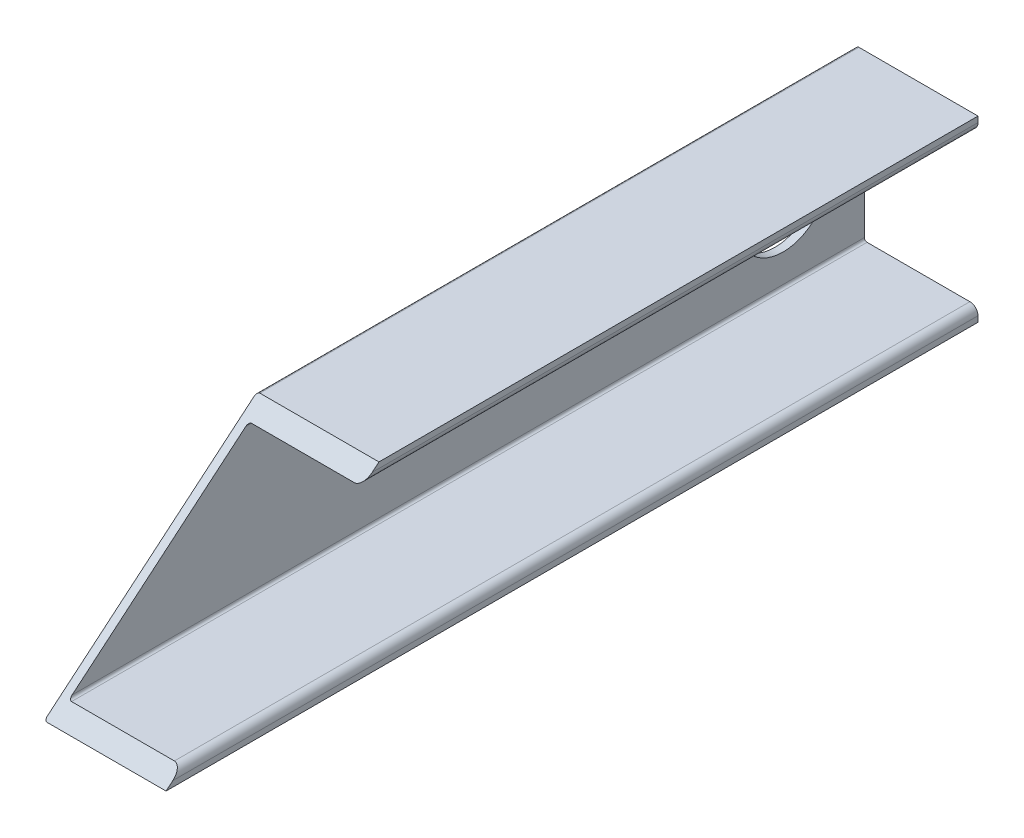
ISO-10303-21;
HEADER;
FILE_DESCRIPTION(('STEP AP214'),'2;1');
FILE_NAME('part.step','',(''),(''),'','','');
FILE_SCHEMA(('AUTOMOTIVE_DESIGN { 1 0 10303 214 1 1 1 1 }'));
ENDSEC;
DATA;
#1=APPLICATION_CONTEXT('core data for automotive mechanical design processes');
#2=APPLICATION_PROTOCOL_DEFINITION('international standard','automotive_design',2000,#1);
#3=PRODUCT_CONTEXT('',#1,'mechanical');
#4=PRODUCT('Part','Part','',(#3));
#5=PRODUCT_RELATED_PRODUCT_CATEGORY('part','',(#4));
#6=PRODUCT_DEFINITION_FORMATION('','',#4);
#7=PRODUCT_DEFINITION_CONTEXT('part definition',#1,'design');
#8=PRODUCT_DEFINITION('design','',#6,#7);
#9=PRODUCT_DEFINITION_SHAPE('','',#8);
#10=(LENGTH_UNIT() NAMED_UNIT(*) SI_UNIT(.MILLI.,.METRE.));
#11=(NAMED_UNIT(*) PLANE_ANGLE_UNIT() SI_UNIT($,.RADIAN.));
#12=(NAMED_UNIT(*) SI_UNIT($,.STERADIAN.) SOLID_ANGLE_UNIT());
#13=UNCERTAINTY_MEASURE_WITH_UNIT(LENGTH_MEASURE(1.E-05),#10,'distance_accuracy_value','');
#14=(GEOMETRIC_REPRESENTATION_CONTEXT(3) GLOBAL_UNCERTAINTY_ASSIGNED_CONTEXT((#13)) GLOBAL_UNIT_ASSIGNED_CONTEXT((#10,
#11,#12)) REPRESENTATION_CONTEXT('',''));
#15=CARTESIAN_POINT('',(0.,0.,0.));
#16=DIRECTION('',(0.,0.,1.));
#17=DIRECTION('',(1.,0.,0.));
#18=AXIS2_PLACEMENT_3D('',#15,#16,#17);
#19=CARTESIAN_POINT('',(3.00000000000002,-27.9,300.));
#20=DIRECTION('',(-1.,0.,0.));
#21=DIRECTION('',(0.,0.,1.));
#22=AXIS2_PLACEMENT_3D('',#19,#20,#21);
#23=PLANE('',#22);
#24=CARTESIAN_POINT('',(3.00000000000002,0.,30.));
#25=DIRECTION('',(-1.,0.,0.));
#26=DIRECTION('',(0.,0.,1.));
#27=AXIS2_PLACEMENT_3D('',#24,#25,#26);
#28=CIRCLE('',#27,16.5);
#29=CARTESIAN_POINT('',(3.00000000000002,0.,46.5));
#30=VERTEX_POINT('',#29);
#31=EDGE_CURVE('E156',#30,#30,#28,.T.);
#32=ORIENTED_EDGE('',*,*,#31,.T.);
#33=EDGE_LOOP('',(#32));
#34=FACE_BOUND('',#33,.T.);
#35=DIRECTION('',(0.,0.642787609686543,-0.766044443118975));
#36=VECTOR('',#35,1.);
#37=CARTESIAN_POINT('',(3.00000000000002,-33.,300.));
#38=LINE('',#37,#36);
#39=CARTESIAN_POINT('',(3.00000000000002,-26.9,292.730303085175));
#40=VERTEX_POINT('',#39);
#41=CARTESIAN_POINT('',(3.00000000000002,26.9,228.613959803608));
#42=VERTEX_POINT('',#41);
#43=EDGE_CURVE('E241',#40,#42,#38,.T.);
#44=ORIENTED_EDGE('',*,*,#43,.F.);
#45=DIRECTION('',(0.,0.,-1.));
#46=VECTOR('',#45,1.);
#47=CARTESIAN_POINT('',(3.00000000000002,-26.9,0.));
#48=LINE('',#47,#46);
#49=CARTESIAN_POINT('',(3.00000000000002,-26.9,0.));
#50=VERTEX_POINT('',#49);
#51=EDGE_CURVE('E194',#40,#50,#48,.T.);
#52=ORIENTED_EDGE('',*,*,#51,.T.);
#53=DIRECTION('',(0.,1.,0.));
#54=VECTOR('',#53,1.);
#55=CARTESIAN_POINT('',(3.00000000000002,-27.9,0.));
#56=LINE('',#55,#54);
#57=CARTESIAN_POINT('',(3.00000000000002,26.9,0.));
#58=VERTEX_POINT('',#57);
#59=EDGE_CURVE('E228',#50,#58,#56,.T.);
#60=ORIENTED_EDGE('',*,*,#59,.T.);
#61=DIRECTION('',(0.,0.,-1.));
#62=VECTOR('',#61,1.);
#63=CARTESIAN_POINT('',(3.00000000000002,26.9,227.422206211013));
#64=LINE('',#63,#62);
#65=EDGE_CURVE('E192',#58,#42,#64,.F.);
#66=ORIENTED_EDGE('',*,*,#65,.T.);
#67=EDGE_LOOP('',(#44,#52,#60,#66));
#68=FACE_BOUND('',#67,.T.);
#69=ADVANCED_FACE('F44',(#34,#68),#23,.F.);
#70=CARTESIAN_POINT('',(3.00000000000002,27.9,300.));
#71=DIRECTION('',(0.,1.,0.));
#72=DIRECTION('',(0.,0.,1.));
#73=AXIS2_PLACEMENT_3D('',#70,#71,#72);
#74=PLANE('',#73);
#75=DIRECTION('',(1.,0.,0.));
#76=VECTOR('',#75,1.);
#77=CARTESIAN_POINT('',(45.001,27.9,227.422206211013));
#78=LINE('',#77,#76);
#79=CARTESIAN_POINT('',(4.00000000000002,27.9,227.422206211013));
#80=VERTEX_POINT('',#79);
#81=CARTESIAN_POINT('',(42.,27.9,227.422206211013));
#82=VERTEX_POINT('',#81);
#83=EDGE_CURVE('E236',#80,#82,#78,.T.);
#84=ORIENTED_EDGE('',*,*,#83,.F.);
#85=DIRECTION('',(0.,0.,-1.));
#86=VECTOR('',#85,1.);
#87=CARTESIAN_POINT('',(4.00000000000002,27.9,0.));
#88=LINE('',#87,#86);
#89=CARTESIAN_POINT('',(4.00000000000002,27.9,0.));
#90=VERTEX_POINT('',#89);
#91=EDGE_CURVE('E216',#80,#90,#88,.T.);
#92=ORIENTED_EDGE('',*,*,#91,.T.);
#93=DIRECTION('',(1.,0.,0.));
#94=VECTOR('',#93,1.);
#95=CARTESIAN_POINT('',(3.00000000000002,27.9,0.));
#96=LINE('',#95,#94);
#97=CARTESIAN_POINT('',(42.,27.9,0.));
#98=VERTEX_POINT('',#97);
#99=EDGE_CURVE('E229',#90,#98,#96,.T.);
#100=ORIENTED_EDGE('',*,*,#99,.T.);
#101=DIRECTION('',(0.,0.,-1.));
#102=VECTOR('',#101,1.);
#103=CARTESIAN_POINT('',(42.,27.9,300.));
#104=LINE('',#103,#102);
#105=EDGE_CURVE('E189',#98,#82,#104,.F.);
#106=ORIENTED_EDGE('',*,*,#105,.T.);
#107=EDGE_LOOP('',(#84,#92,#100,#106));
#108=FACE_BOUND('',#107,.T.);
#109=ADVANCED_FACE('F239',(#108),#74,.F.);
#110=CARTESIAN_POINT('',(45.,27.9,300.));
#111=DIRECTION('',(-1.,0.,0.));
#112=DIRECTION('',(0.,0.,1.));
#113=AXIS2_PLACEMENT_3D('',#110,#111,#112);
#114=PLANE('',#113);
#115=DIRECTION('',(0.,0.642787609686543,-0.766044443118975));
#116=VECTOR('',#115,1.);
#117=CARTESIAN_POINT('',(45.,-33.,300.));
#118=LINE('',#117,#116);
#119=CARTESIAN_POINT('',(45.,30.9,223.846945433231));
#120=VERTEX_POINT('',#119);
#121=CARTESIAN_POINT('',(45.,33.,221.344262888783));
#122=VERTEX_POINT('',#121);
#123=EDGE_CURVE('E144',#120,#122,#118,.T.);
#124=ORIENTED_EDGE('',*,*,#123,.F.);
#125=DIRECTION('',(0.,0.,-1.));
#126=VECTOR('',#125,1.);
#127=CARTESIAN_POINT('',(45.,30.9,300.));
#128=LINE('',#127,#126);
#129=CARTESIAN_POINT('',(45.,30.9,0.));
#130=VERTEX_POINT('',#129);
#131=EDGE_CURVE('E187',#120,#130,#128,.T.);
#132=ORIENTED_EDGE('',*,*,#131,.T.);
#133=DIRECTION('',(0.,1.,0.));
#134=VECTOR('',#133,1.);
#135=CARTESIAN_POINT('',(45.,27.9,0.));
#136=LINE('',#135,#134);
#137=CARTESIAN_POINT('',(45.,33.,0.));
#138=VERTEX_POINT('',#137);
#139=EDGE_CURVE('E166',#130,#138,#136,.T.);
#140=ORIENTED_EDGE('',*,*,#139,.T.);
#141=DIRECTION('',(0.,0.,-1.));
#142=VECTOR('',#141,1.);
#143=CARTESIAN_POINT('',(45.,33.,300.));
#144=LINE('',#143,#142);
#145=EDGE_CURVE('E160',#122,#138,#144,.T.);
#146=ORIENTED_EDGE('',*,*,#145,.F.);
#147=EDGE_LOOP('',(#124,#132,#140,#146));
#148=FACE_BOUND('',#147,.T.);
#149=ADVANCED_FACE('F164',(#148),#114,.F.);
#150=CARTESIAN_POINT('',(0.,33.,300.));
#151=DIRECTION('',(0.,-1.,0.));
#152=DIRECTION('',(0.,0.,-1.));
#153=AXIS2_PLACEMENT_3D('',#150,#151,#152);
#154=PLANE('',#153);
#155=DIRECTION('',(-1.,0.,0.));
#156=VECTOR('',#155,1.);
#157=CARTESIAN_POINT('',(0.,33.,0.));
#158=LINE('',#157,#156);
#159=CARTESIAN_POINT('',(0.99999999999999,33.,0.));
#160=VERTEX_POINT('',#159);
#161=EDGE_CURVE('E251',#138,#160,#158,.T.);
#162=ORIENTED_EDGE('',*,*,#161,.T.);
#163=DIRECTION('',(0.,0.,-1.));
#164=VECTOR('',#163,1.);
#165=CARTESIAN_POINT('',(0.99999999999999,33.,300.));
#166=LINE('',#165,#164);
#167=CARTESIAN_POINT('',(0.999999999999987,33.,221.344262888783));
#168=VERTEX_POINT('',#167);
#169=EDGE_CURVE('E59',#160,#168,#166,.F.);
#170=ORIENTED_EDGE('',*,*,#169,.T.);
#171=DIRECTION('',(-1.,0.,0.));
#172=VECTOR('',#171,1.);
#173=CARTESIAN_POINT('',(45.001,33.,221.344262888783));
#174=LINE('',#173,#172);
#175=EDGE_CURVE('E147',#122,#168,#174,.T.);
#176=ORIENTED_EDGE('',*,*,#175,.F.);
#177=ORIENTED_EDGE('',*,*,#145,.T.);
#178=EDGE_LOOP('',(#162,#170,#176,#177));
#179=FACE_BOUND('',#178,.T.);
#180=ADVANCED_FACE('F159',(#179),#154,.F.);
#181=CARTESIAN_POINT('',(0.,33.,300.));
#182=DIRECTION('',(1.,0.,0.));
#183=DIRECTION('',(0.,1.,0.));
#184=AXIS2_PLACEMENT_3D('',#181,#182,#183);
#185=PLANE('',#184);
#186=CARTESIAN_POINT('',(0.,0.,30.));
#187=DIRECTION('',(-1.,0.,0.));
#188=DIRECTION('',(0.,-1.,0.));
#189=AXIS2_PLACEMENT_3D('',#186,#187,#188);
#190=CIRCLE('',#189,16.5);
#191=CARTESIAN_POINT('',(0.,-16.5,30.));
#192=VERTEX_POINT('',#191);
#193=EDGE_CURVE('E278',#192,#192,#190,.T.);
#194=ORIENTED_EDGE('',*,*,#193,.F.);
#195=EDGE_LOOP('',(#194));
#196=FACE_BOUND('',#195,.T.);
#197=DIRECTION('',(0.,-1.,0.));
#198=VECTOR('',#197,1.);
#199=CARTESIAN_POINT('',(0.,33.,0.));
#200=LINE('',#199,#198);
#201=CARTESIAN_POINT('',(0.,32.,0.));
#202=VERTEX_POINT('',#201);
#203=CARTESIAN_POINT('',(0.,-32.,0.));
#204=VERTEX_POINT('',#203);
#205=EDGE_CURVE('E253',#202,#204,#200,.T.);
#206=ORIENTED_EDGE('',*,*,#205,.T.);
#207=DIRECTION('',(0.,0.,-1.));
#208=VECTOR('',#207,1.);
#209=CARTESIAN_POINT('',(0.,-32.,300.));
#210=LINE('',#209,#208);
#211=CARTESIAN_POINT('',(0.,-32.,298.808246407406));
#212=VERTEX_POINT('',#211);
#213=EDGE_CURVE('E209',#204,#212,#210,.F.);
#214=ORIENTED_EDGE('',*,*,#213,.T.);
#215=DIRECTION('',(0.,-0.642787609686543,0.766044443118975));
#216=VECTOR('',#215,1.);
#217=CARTESIAN_POINT('',(0.,-33.,300.));
#218=LINE('',#217,#216);
#219=CARTESIAN_POINT('',(0.,32.,222.536016481377));
#220=VERTEX_POINT('',#219);
#221=EDGE_CURVE('E155',#220,#212,#218,.T.);
#222=ORIENTED_EDGE('',*,*,#221,.F.);
#223=DIRECTION('',(0.,0.,-1.));
#224=VECTOR('',#223,1.);
#225=CARTESIAN_POINT('',(0.,32.,300.));
#226=LINE('',#225,#224);
#227=EDGE_CURVE('E206',#220,#202,#226,.T.);
#228=ORIENTED_EDGE('',*,*,#227,.T.);
#229=EDGE_LOOP('',(#206,#214,#222,#228));
#230=FACE_BOUND('',#229,.T.);
#231=ADVANCED_FACE('F285',(#196,#230),#185,.F.);
#232=CARTESIAN_POINT('',(0.,-33.,300.));
#233=DIRECTION('',(0.,1.,0.));
#234=DIRECTION('',(0.,0.,1.));
#235=AXIS2_PLACEMENT_3D('',#232,#233,#234);
#236=PLANE('',#235);
#237=DIRECTION('',(1.,0.,0.));
#238=VECTOR('',#237,1.);
#239=CARTESIAN_POINT('',(0.,-33.,300.));
#240=LINE('',#239,#238);
#241=CARTESIAN_POINT('',(1.00000000000001,-33.,300.));
#242=VERTEX_POINT('',#241);
#243=CARTESIAN_POINT('',(45.,-33.,300.));
#244=VERTEX_POINT('',#243);
#245=EDGE_CURVE('E174',#242,#244,#240,.T.);
#246=ORIENTED_EDGE('',*,*,#245,.F.);
#247=DIRECTION('',(0.,0.,-1.));
#248=VECTOR('',#247,1.);
#249=CARTESIAN_POINT('',(1.00000000000001,-33.,300.));
#250=LINE('',#249,#248);
#251=CARTESIAN_POINT('',(1.00000000000001,-33.,0.));
#252=VERTEX_POINT('',#251);
#253=EDGE_CURVE('E199',#242,#252,#250,.T.);
#254=ORIENTED_EDGE('',*,*,#253,.T.);
#255=DIRECTION('',(1.,0.,0.));
#256=VECTOR('',#255,1.);
#257=CARTESIAN_POINT('',(0.,-33.,0.));
#258=LINE('',#257,#256);
#259=CARTESIAN_POINT('',(45.,-33.,0.));
#260=VERTEX_POINT('',#259);
#261=EDGE_CURVE('E256',#252,#260,#258,.T.);
#262=ORIENTED_EDGE('',*,*,#261,.T.);
#263=DIRECTION('',(0.,0.,-1.));
#264=VECTOR('',#263,1.);
#265=CARTESIAN_POINT('',(45.,-33.,300.));
#266=LINE('',#265,#264);
#267=EDGE_CURVE('E168',#244,#260,#266,.T.);
#268=ORIENTED_EDGE('',*,*,#267,.F.);
#269=EDGE_LOOP('',(#246,#254,#262,#268));
#270=FACE_BOUND('',#269,.T.);
#271=ADVANCED_FACE('F288',(#270),#236,.F.);
#272=CARTESIAN_POINT('',(45.,-33.,300.));
#273=DIRECTION('',(-1.,0.,0.));
#274=DIRECTION('',(0.,0.,1.));
#275=AXIS2_PLACEMENT_3D('',#272,#273,#274);
#276=PLANE('',#275);
#277=DIRECTION('',(0.,1.,0.));
#278=VECTOR('',#277,1.);
#279=CARTESIAN_POINT('',(45.,-33.,0.));
#280=LINE('',#279,#278);
#281=CARTESIAN_POINT('',(45.,-30.9,0.));
#282=VERTEX_POINT('',#281);
#283=EDGE_CURVE('E258',#260,#282,#280,.T.);
#284=ORIENTED_EDGE('',*,*,#283,.T.);
#285=DIRECTION('',(0.,0.,-1.));
#286=VECTOR('',#285,1.);
#287=CARTESIAN_POINT('',(45.,-30.9,300.));
#288=LINE('',#287,#286);
#289=CARTESIAN_POINT('',(45.,-30.9,297.497317455552));
#290=VERTEX_POINT('',#289);
#291=EDGE_CURVE('E182',#282,#290,#288,.F.);
#292=ORIENTED_EDGE('',*,*,#291,.T.);
#293=DIRECTION('',(0.,0.642787609686543,-0.766044443118975));
#294=VECTOR('',#293,1.);
#295=CARTESIAN_POINT('',(45.,-33.,300.));
#296=LINE('',#295,#294);
#297=EDGE_CURVE('E243',#244,#290,#296,.T.);
#298=ORIENTED_EDGE('',*,*,#297,.F.);
#299=ORIENTED_EDGE('',*,*,#267,.T.);
#300=EDGE_LOOP('',(#284,#292,#298,#299));
#301=FACE_BOUND('',#300,.T.);
#302=ADVANCED_FACE('F304',(#301),#276,.F.);
#303=CARTESIAN_POINT('',(45.,-27.9,300.));
#304=DIRECTION('',(0.,-1.,0.));
#305=DIRECTION('',(0.,0.,-1.));
#306=AXIS2_PLACEMENT_3D('',#303,#304,#305);
#307=PLANE('',#306);
#308=DIRECTION('',(-1.,0.,0.));
#309=VECTOR('',#308,1.);
#310=CARTESIAN_POINT('',(45.,-27.9,0.));
#311=LINE('',#310,#309);
#312=CARTESIAN_POINT('',(42.,-27.9,0.));
#313=VERTEX_POINT('',#312);
#314=CARTESIAN_POINT('',(4.00000000000002,-27.9,0.));
#315=VERTEX_POINT('',#314);
#316=EDGE_CURVE('E247',#313,#315,#311,.T.);
#317=ORIENTED_EDGE('',*,*,#316,.T.);
#318=DIRECTION('',(0.,0.,-1.));
#319=VECTOR('',#318,1.);
#320=CARTESIAN_POINT('',(4.00000000000002,-27.9,293.92205667777));
#321=LINE('',#320,#319);
#322=CARTESIAN_POINT('',(4.00000000000002,-27.9,293.92205667777));
#323=VERTEX_POINT('',#322);
#324=EDGE_CURVE('E197',#315,#323,#321,.F.);
#325=ORIENTED_EDGE('',*,*,#324,.T.);
#326=DIRECTION('',(-1.,0.,0.));
#327=VECTOR('',#326,1.);
#328=CARTESIAN_POINT('',(45.001,-27.9,293.92205667777));
#329=LINE('',#328,#327);
#330=CARTESIAN_POINT('',(42.,-27.9,293.92205667777));
#331=VERTEX_POINT('',#330);
#332=EDGE_CURVE('E162',#331,#323,#329,.T.);
#333=ORIENTED_EDGE('',*,*,#332,.F.);
#334=DIRECTION('',(0.,0.,-1.));
#335=VECTOR('',#334,1.);
#336=CARTESIAN_POINT('',(42.,-27.9,300.));
#337=LINE('',#336,#335);
#338=EDGE_CURVE('E167',#331,#313,#337,.T.);
#339=ORIENTED_EDGE('',*,*,#338,.T.);
#340=EDGE_LOOP('',(#317,#325,#333,#339));
#341=FACE_BOUND('',#340,.T.);
#342=ADVANCED_FACE('F264',(#341),#307,.F.);
#343=CARTESIAN_POINT('',(0.,0.,0.));
#344=DIRECTION('',(0.,0.,-1.));
#345=DIRECTION('',(-1.,0.,0.));
#346=AXIS2_PLACEMENT_3D('',#343,#344,#345);
#347=PLANE('',#346);
#348=ORIENTED_EDGE('',*,*,#261,.F.);
#349=CARTESIAN_POINT('',(1.00000000000001,-32.,0.));
#350=DIRECTION('',(0.,0.,-1.));
#351=DIRECTION('',(-1.,0.,0.));
#352=AXIS2_PLACEMENT_3D('',#349,#350,#351);
#353=CIRCLE('',#352,1.);
#354=EDGE_CURVE('E204',#252,#204,#353,.T.);
#355=ORIENTED_EDGE('',*,*,#354,.T.);
#356=ORIENTED_EDGE('',*,*,#205,.F.);
#357=CARTESIAN_POINT('',(0.99999999999999,32.,0.));
#358=DIRECTION('',(0.,0.,-1.));
#359=DIRECTION('',(-1.,0.,0.));
#360=AXIS2_PLACEMENT_3D('',#357,#358,#359);
#361=CIRCLE('',#360,1.);
#362=EDGE_CURVE('E202',#202,#160,#361,.T.);
#363=ORIENTED_EDGE('',*,*,#362,.T.);
#364=ORIENTED_EDGE('',*,*,#161,.F.);
#365=ORIENTED_EDGE('',*,*,#139,.F.);
#366=CARTESIAN_POINT('',(42.,30.9,0.));
#367=DIRECTION('',(0.,0.,-1.));
#368=DIRECTION('',(-1.,0.,0.));
#369=AXIS2_PLACEMENT_3D('',#366,#367,#368);
#370=CIRCLE('',#369,3.);
#371=EDGE_CURVE('E171',#130,#98,#370,.T.);
#372=ORIENTED_EDGE('',*,*,#371,.T.);
#373=ORIENTED_EDGE('',*,*,#99,.F.);
#374=CARTESIAN_POINT('',(4.00000000000002,26.9,0.));
#375=DIRECTION('',(0.,0.,-1.));
#376=DIRECTION('',(-1.,0.,0.));
#377=AXIS2_PLACEMENT_3D('',#374,#375,#376);
#378=CIRCLE('',#377,1.);
#379=EDGE_CURVE('E52',#90,#58,#378,.F.);
#380=ORIENTED_EDGE('',*,*,#379,.T.);
#381=ORIENTED_EDGE('',*,*,#59,.F.);
#382=CARTESIAN_POINT('',(4.00000000000002,-26.9,0.));
#383=DIRECTION('',(0.,0.,-1.));
#384=DIRECTION('',(-1.,0.,0.));
#385=AXIS2_PLACEMENT_3D('',#382,#383,#384);
#386=CIRCLE('',#385,1.);
#387=EDGE_CURVE('E219',#50,#315,#386,.F.);
#388=ORIENTED_EDGE('',*,*,#387,.T.);
#389=ORIENTED_EDGE('',*,*,#316,.F.);
#390=CARTESIAN_POINT('',(42.,-30.9,0.));
#391=DIRECTION('',(0.,0.,-1.));
#392=DIRECTION('',(-1.,0.,0.));
#393=AXIS2_PLACEMENT_3D('',#390,#391,#392);
#394=CIRCLE('',#393,3.);
#395=EDGE_CURVE('E180',#313,#282,#394,.T.);
#396=ORIENTED_EDGE('',*,*,#395,.T.);
#397=ORIENTED_EDGE('',*,*,#283,.F.);
#398=EDGE_LOOP('',(#348,#355,#356,#363,#364,#365,#372,#373,#380,#381,#388,#389,#396,#397));
#399=FACE_BOUND('',#398,.T.);
#400=ADVANCED_FACE('F227',(#399),#347,.T.);
#401=CARTESIAN_POINT('',(45.001,-33.,300.));
#402=DIRECTION('',(0.,-0.766044443118975,-0.642787609686543));
#403=DIRECTION('',(0.,0.642787609686543,-0.766044443118975));
#404=AXIS2_PLACEMENT_3D('',#401,#402,#403);
#405=PLANE('',#404);
#406=ORIENTED_EDGE('',*,*,#221,.T.);
#407=CARTESIAN_POINT('',(1.00000000000001,-32.,298.808246407406));
#408=DIRECTION('',(0.,-0.766044443118975,-0.642787609686543));
#409=DIRECTION('',(0.,0.642787609686543,-0.766044443118975));
#410=AXIS2_PLACEMENT_3D('',#407,#408,#409);
#411=ELLIPSE('',#410,1.5557238268604,1.);
#412=EDGE_CURVE('E213',#212,#242,#411,.F.);
#413=ORIENTED_EDGE('',*,*,#412,.T.);
#414=ORIENTED_EDGE('',*,*,#245,.T.);
#415=ORIENTED_EDGE('',*,*,#297,.T.);
#416=CARTESIAN_POINT('',(42.,-30.9,297.497317455552));
#417=DIRECTION('',(0.,-0.766044443118975,-0.642787609686543));
#418=DIRECTION('',(0.,0.642787609686543,-0.766044443118975));
#419=AXIS2_PLACEMENT_3D('',#416,#417,#418);
#420=ELLIPSE('',#419,4.66717148058121,3.);
#421=EDGE_CURVE('E185',#290,#331,#420,.F.);
#422=ORIENTED_EDGE('',*,*,#421,.T.);
#423=ORIENTED_EDGE('',*,*,#332,.T.);
#424=CARTESIAN_POINT('',(4.00000000000002,-26.9,292.730303085175));
#425=DIRECTION('',(0.,-0.766044443118975,-0.642787609686543));
#426=DIRECTION('',(0.,-0.642787609686543,0.766044443118975));
#427=AXIS2_PLACEMENT_3D('',#424,#425,#426);
#428=ELLIPSE('',#427,1.5557238268604,1.);
#429=EDGE_CURVE('E221',#323,#40,#428,.T.);
#430=ORIENTED_EDGE('',*,*,#429,.T.);
#431=ORIENTED_EDGE('',*,*,#43,.T.);
#432=CARTESIAN_POINT('',(4.00000000000002,26.9,228.613959803608));
#433=DIRECTION('',(0.,-0.766044443118975,-0.642787609686543));
#434=DIRECTION('',(0.,-0.642787609686543,0.766044443118975));
#435=AXIS2_PLACEMENT_3D('',#432,#433,#434);
#436=ELLIPSE('',#435,1.5557238268604,1.);
#437=EDGE_CURVE('E11',#42,#80,#436,.T.);
#438=ORIENTED_EDGE('',*,*,#437,.T.);
#439=ORIENTED_EDGE('',*,*,#83,.T.);
#440=CARTESIAN_POINT('',(42.,30.9,223.846945433231));
#441=DIRECTION('',(0.,-0.766044443118975,-0.642787609686543));
#442=DIRECTION('',(0.,0.642787609686543,-0.766044443118975));
#443=AXIS2_PLACEMENT_3D('',#440,#441,#442);
#444=ELLIPSE('',#443,4.66717148058121,3.);
#445=EDGE_CURVE('E150',#82,#120,#444,.F.);
#446=ORIENTED_EDGE('',*,*,#445,.T.);
#447=ORIENTED_EDGE('',*,*,#123,.T.);
#448=ORIENTED_EDGE('',*,*,#175,.T.);
#449=CARTESIAN_POINT('',(0.99999999999999,32.,222.536016481377));
#450=DIRECTION('',(0.,-0.766044443118975,-0.642787609686543));
#451=DIRECTION('',(0.,0.642787609686543,-0.766044443118975));
#452=AXIS2_PLACEMENT_3D('',#449,#450,#451);
#453=ELLIPSE('',#452,1.5557238268604,1.);
#454=EDGE_CURVE('E211',#168,#220,#453,.F.);
#455=ORIENTED_EDGE('',*,*,#454,.T.);
#456=EDGE_LOOP('',(#406,#413,#414,#415,#422,#423,#430,#431,#438,#439,#446,#447,#448,#455));
#457=FACE_BOUND('',#456,.T.);
#458=ADVANCED_FACE('F146',(#457),#405,.F.);
#459=CARTESIAN_POINT('',(42.,-30.9,300.));
#460=DIRECTION('',(0.,0.,-1.));
#461=DIRECTION('',(-1.,0.,0.));
#462=AXIS2_PLACEMENT_3D('',#459,#460,#461);
#463=CYLINDRICAL_SURFACE('',#462,3.);
#464=ORIENTED_EDGE('',*,*,#421,.F.);
#465=ORIENTED_EDGE('',*,*,#291,.F.);
#466=ORIENTED_EDGE('',*,*,#395,.F.);
#467=ORIENTED_EDGE('',*,*,#338,.F.);
#468=EDGE_LOOP('',(#464,#465,#466,#467));
#469=FACE_BOUND('',#468,.T.);
#470=ADVANCED_FACE('F307',(#469),#463,.T.);
#471=CARTESIAN_POINT('',(42.,30.9,300.));
#472=DIRECTION('',(0.,0.,-1.));
#473=DIRECTION('',(-1.,0.,0.));
#474=AXIS2_PLACEMENT_3D('',#471,#472,#473);
#475=CYLINDRICAL_SURFACE('',#474,3.);
#476=ORIENTED_EDGE('',*,*,#445,.F.);
#477=ORIENTED_EDGE('',*,*,#105,.F.);
#478=ORIENTED_EDGE('',*,*,#371,.F.);
#479=ORIENTED_EDGE('',*,*,#131,.F.);
#480=EDGE_LOOP('',(#476,#477,#478,#479));
#481=FACE_BOUND('',#480,.T.);
#482=ADVANCED_FACE('F309',(#481),#475,.T.);
#483=CARTESIAN_POINT('',(4.00000000000002,-26.9,300.));
#484=DIRECTION('',(0.,0.,1.));
#485=DIRECTION('',(1.,0.,0.));
#486=AXIS2_PLACEMENT_3D('',#483,#484,#485);
#487=CYLINDRICAL_SURFACE('',#486,1.);
#488=ORIENTED_EDGE('',*,*,#429,.F.);
#489=ORIENTED_EDGE('',*,*,#324,.F.);
#490=ORIENTED_EDGE('',*,*,#387,.F.);
#491=ORIENTED_EDGE('',*,*,#51,.F.);
#492=EDGE_LOOP('',(#488,#489,#490,#491));
#493=FACE_BOUND('',#492,.T.);
#494=ADVANCED_FACE('F270',(#493),#487,.F.);
#495=CARTESIAN_POINT('',(1.00000000000001,-32.,300.));
#496=DIRECTION('',(0.,0.,-1.));
#497=DIRECTION('',(-1.,0.,0.));
#498=AXIS2_PLACEMENT_3D('',#495,#496,#497);
#499=CYLINDRICAL_SURFACE('',#498,1.);
#500=ORIENTED_EDGE('',*,*,#412,.F.);
#501=ORIENTED_EDGE('',*,*,#213,.F.);
#502=ORIENTED_EDGE('',*,*,#354,.F.);
#503=ORIENTED_EDGE('',*,*,#253,.F.);
#504=EDGE_LOOP('',(#500,#501,#502,#503));
#505=FACE_BOUND('',#504,.T.);
#506=ADVANCED_FACE('F296',(#505),#499,.T.);
#507=CARTESIAN_POINT('',(0.99999999999999,32.,300.));
#508=DIRECTION('',(0.,0.,-1.));
#509=DIRECTION('',(-1.,0.,0.));
#510=AXIS2_PLACEMENT_3D('',#507,#508,#509);
#511=CYLINDRICAL_SURFACE('',#510,1.);
#512=ORIENTED_EDGE('',*,*,#454,.F.);
#513=ORIENTED_EDGE('',*,*,#169,.F.);
#514=ORIENTED_EDGE('',*,*,#362,.F.);
#515=ORIENTED_EDGE('',*,*,#227,.F.);
#516=EDGE_LOOP('',(#512,#513,#514,#515));
#517=FACE_BOUND('',#516,.T.);
#518=ADVANCED_FACE('F342',(#517),#511,.T.);
#519=CARTESIAN_POINT('',(4.00000000000002,26.9,300.));
#520=DIRECTION('',(0.,0.,1.));
#521=DIRECTION('',(1.,0.,0.));
#522=AXIS2_PLACEMENT_3D('',#519,#520,#521);
#523=CYLINDRICAL_SURFACE('',#522,1.);
#524=ORIENTED_EDGE('',*,*,#437,.F.);
#525=ORIENTED_EDGE('',*,*,#65,.F.);
#526=ORIENTED_EDGE('',*,*,#379,.F.);
#527=ORIENTED_EDGE('',*,*,#91,.F.);
#528=EDGE_LOOP('',(#524,#525,#526,#527));
#529=FACE_BOUND('',#528,.T.);
#530=ADVANCED_FACE('F46',(#529),#523,.F.);
#531=CARTESIAN_POINT('',(50.,0.,30.));
#532=DIRECTION('',(-1.,0.,0.));
#533=DIRECTION('',(0.,-1.,0.));
#534=AXIS2_PLACEMENT_3D('',#531,#532,#533);
#535=CYLINDRICAL_SURFACE('',#534,16.5);
#536=ORIENTED_EDGE('',*,*,#193,.T.);
#537=EDGE_LOOP('',(#536));
#538=FACE_BOUND('',#537,.T.);
#539=ORIENTED_EDGE('',*,*,#31,.F.);
#540=EDGE_LOOP('',(#539));
#541=FACE_BOUND('',#540,.T.);
#542=ADVANCED_FACE('F282',(#538,#541),#535,.F.);
#543=CLOSED_SHELL('',(#69,#109,#149,#180,#231,#271,#302,#342,#400,#458,#470,#482,#494,#506,#518,
#530,#542));
#544=MANIFOLD_SOLID_BREP('B2',#543);
#545=ADVANCED_BREP_SHAPE_REPRESENTATION('',(#18,#544),#14);
#546=SHAPE_DEFINITION_REPRESENTATION(#9,#545);
ENDSEC;
END-ISO-10303-21;
